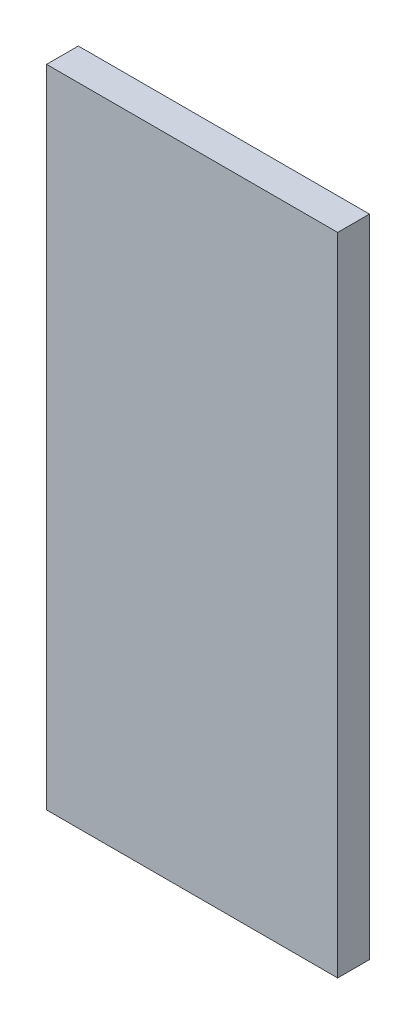
ISO-10303-21;
HEADER;
FILE_DESCRIPTION(('STEP AP214'),'2;1');
FILE_NAME('part.step','',(''),(''),'','','');
FILE_SCHEMA(('AUTOMOTIVE_DESIGN { 1 0 10303 214 1 1 1 1 }'));
ENDSEC;
DATA;
#1=APPLICATION_CONTEXT('core data for automotive mechanical design processes');
#2=APPLICATION_PROTOCOL_DEFINITION('international standard','automotive_design',2000,#1);
#3=PRODUCT_CONTEXT('',#1,'mechanical');
#4=PRODUCT('Part','Part','',(#3));
#5=PRODUCT_RELATED_PRODUCT_CATEGORY('part','',(#4));
#6=PRODUCT_DEFINITION_FORMATION('','',#4);
#7=PRODUCT_DEFINITION_CONTEXT('part definition',#1,'design');
#8=PRODUCT_DEFINITION('design','',#6,#7);
#9=PRODUCT_DEFINITION_SHAPE('','',#8);
#10=(LENGTH_UNIT() NAMED_UNIT(*) SI_UNIT(.MILLI.,.METRE.));
#11=(NAMED_UNIT(*) PLANE_ANGLE_UNIT() SI_UNIT($,.RADIAN.));
#12=(NAMED_UNIT(*) SI_UNIT($,.STERADIAN.) SOLID_ANGLE_UNIT());
#13=UNCERTAINTY_MEASURE_WITH_UNIT(LENGTH_MEASURE(1.E-05),#10,'distance_accuracy_value','');
#14=(GEOMETRIC_REPRESENTATION_CONTEXT(3) GLOBAL_UNCERTAINTY_ASSIGNED_CONTEXT((#13)) GLOBAL_UNIT_ASSIGNED_CONTEXT((#10,
#11,#12)) REPRESENTATION_CONTEXT('',''));
#15=CARTESIAN_POINT('',(0.,0.,0.));
#16=DIRECTION('',(0.,0.,1.));
#17=DIRECTION('',(1.,0.,0.));
#18=AXIS2_PLACEMENT_3D('',#15,#16,#17);
#19=CARTESIAN_POINT('',(13.75,30.5,3.));
#20=DIRECTION('',(-1.,0.,0.));
#21=DIRECTION('',(0.,-1.,0.));
#22=AXIS2_PLACEMENT_3D('',#19,#20,#21);
#23=PLANE('',#22);
#24=DIRECTION('',(0.,1.,0.));
#25=VECTOR('',#24,1.);
#26=CARTESIAN_POINT('',(13.75,30.5,0.));
#27=LINE('',#26,#25);
#28=CARTESIAN_POINT('',(13.75,-30.5,0.));
#29=VERTEX_POINT('',#28);
#30=CARTESIAN_POINT('',(13.75,30.5,0.));
#31=VERTEX_POINT('',#30);
#32=EDGE_CURVE('E100',#29,#31,#27,.T.);
#33=ORIENTED_EDGE('',*,*,#32,.T.);
#34=DIRECTION('',(0.,0.,-1.));
#35=VECTOR('',#34,1.);
#36=CARTESIAN_POINT('',(13.75,30.5,3.));
#37=LINE('',#36,#35);
#38=CARTESIAN_POINT('',(13.75,30.5,3.));
#39=VERTEX_POINT('',#38);
#40=EDGE_CURVE('E11',#39,#31,#37,.T.);
#41=ORIENTED_EDGE('',*,*,#40,.F.);
#42=DIRECTION('',(0.,1.,0.));
#43=VECTOR('',#42,1.);
#44=CARTESIAN_POINT('',(13.75,30.5,3.));
#45=LINE('',#44,#43);
#46=CARTESIAN_POINT('',(13.75,-30.5,3.));
#47=VERTEX_POINT('',#46);
#48=EDGE_CURVE('E88',#47,#39,#45,.T.);
#49=ORIENTED_EDGE('',*,*,#48,.F.);
#50=DIRECTION('',(0.,0.,-1.));
#51=VECTOR('',#50,1.);
#52=CARTESIAN_POINT('',(13.75,-30.5,3.));
#53=LINE('',#52,#51);
#54=EDGE_CURVE('E96',#47,#29,#53,.T.);
#55=ORIENTED_EDGE('',*,*,#54,.T.);
#56=EDGE_LOOP('',(#33,#41,#49,#55));
#57=FACE_BOUND('',#56,.T.);
#58=ADVANCED_FACE('F37',(#57),#23,.F.);
#59=CARTESIAN_POINT('',(-13.75,30.5,3.));
#60=DIRECTION('',(0.,-1.,0.));
#61=DIRECTION('',(0.,0.,-1.));
#62=AXIS2_PLACEMENT_3D('',#59,#60,#61);
#63=PLANE('',#62);
#64=DIRECTION('',(-1.,0.,0.));
#65=VECTOR('',#64,1.);
#66=CARTESIAN_POINT('',(-13.75,30.5,0.));
#67=LINE('',#66,#65);
#68=CARTESIAN_POINT('',(-13.75,30.5,0.));
#69=VERTEX_POINT('',#68);
#70=EDGE_CURVE('E92',#31,#69,#67,.T.);
#71=ORIENTED_EDGE('',*,*,#70,.T.);
#72=DIRECTION('',(0.,0.,-1.));
#73=VECTOR('',#72,1.);
#74=CARTESIAN_POINT('',(-13.75,30.5,3.));
#75=LINE('',#74,#73);
#76=CARTESIAN_POINT('',(-13.75,30.5,3.));
#77=VERTEX_POINT('',#76);
#78=EDGE_CURVE('E45',#77,#69,#75,.T.);
#79=ORIENTED_EDGE('',*,*,#78,.F.);
#80=DIRECTION('',(-1.,0.,0.));
#81=VECTOR('',#80,1.);
#82=CARTESIAN_POINT('',(-13.75,30.5,3.));
#83=LINE('',#82,#81);
#84=EDGE_CURVE('E83',#39,#77,#83,.T.);
#85=ORIENTED_EDGE('',*,*,#84,.F.);
#86=ORIENTED_EDGE('',*,*,#40,.T.);
#87=EDGE_LOOP('',(#71,#79,#85,#86));
#88=FACE_BOUND('',#87,.T.);
#89=ADVANCED_FACE('F91',(#88),#63,.F.);
#90=CARTESIAN_POINT('',(-13.75,30.5,3.));
#91=DIRECTION('',(1.,0.,0.));
#92=DIRECTION('',(0.,1.,0.));
#93=AXIS2_PLACEMENT_3D('',#90,#91,#92);
#94=PLANE('',#93);
#95=DIRECTION('',(0.,-1.,0.));
#96=VECTOR('',#95,1.);
#97=CARTESIAN_POINT('',(-13.75,30.5,0.));
#98=LINE('',#97,#96);
#99=CARTESIAN_POINT('',(-13.75,-30.5,0.));
#100=VERTEX_POINT('',#99);
#101=EDGE_CURVE('E70',#69,#100,#98,.T.);
#102=ORIENTED_EDGE('',*,*,#101,.T.);
#103=DIRECTION('',(0.,0.,-1.));
#104=VECTOR('',#103,1.);
#105=CARTESIAN_POINT('',(-13.75,-30.5,3.));
#106=LINE('',#105,#104);
#107=CARTESIAN_POINT('',(-13.75,-30.5,3.));
#108=VERTEX_POINT('',#107);
#109=EDGE_CURVE('E93',#108,#100,#106,.T.);
#110=ORIENTED_EDGE('',*,*,#109,.F.);
#111=DIRECTION('',(0.,-1.,0.));
#112=VECTOR('',#111,1.);
#113=CARTESIAN_POINT('',(-13.75,30.5,3.));
#114=LINE('',#113,#112);
#115=EDGE_CURVE('E86',#77,#108,#114,.T.);
#116=ORIENTED_EDGE('',*,*,#115,.F.);
#117=ORIENTED_EDGE('',*,*,#78,.T.);
#118=EDGE_LOOP('',(#102,#110,#116,#117));
#119=FACE_BOUND('',#118,.T.);
#120=ADVANCED_FACE('F94',(#119),#94,.F.);
#121=CARTESIAN_POINT('',(-13.75,-30.5,3.));
#122=DIRECTION('',(0.,1.,0.));
#123=DIRECTION('',(0.,0.,1.));
#124=AXIS2_PLACEMENT_3D('',#121,#122,#123);
#125=PLANE('',#124);
#126=DIRECTION('',(1.,0.,0.));
#127=VECTOR('',#126,1.);
#128=CARTESIAN_POINT('',(-13.75,-30.5,0.));
#129=LINE('',#128,#127);
#130=EDGE_CURVE('E76',#100,#29,#129,.T.);
#131=ORIENTED_EDGE('',*,*,#130,.T.);
#132=ORIENTED_EDGE('',*,*,#54,.F.);
#133=DIRECTION('',(1.,0.,0.));
#134=VECTOR('',#133,1.);
#135=CARTESIAN_POINT('',(-13.75,-30.5,3.));
#136=LINE('',#135,#134);
#137=EDGE_CURVE('E53',#108,#47,#136,.T.);
#138=ORIENTED_EDGE('',*,*,#137,.F.);
#139=ORIENTED_EDGE('',*,*,#109,.T.);
#140=EDGE_LOOP('',(#131,#132,#138,#139));
#141=FACE_BOUND('',#140,.T.);
#142=ADVANCED_FACE('F107',(#141),#125,.F.);
#143=CARTESIAN_POINT('',(0.,0.,3.));
#144=DIRECTION('',(0.,0.,1.));
#145=DIRECTION('',(1.,0.,0.));
#146=AXIS2_PLACEMENT_3D('',#143,#144,#145);
#147=PLANE('',#146);
#148=ORIENTED_EDGE('',*,*,#48,.T.);
#149=ORIENTED_EDGE('',*,*,#84,.T.);
#150=ORIENTED_EDGE('',*,*,#115,.T.);
#151=ORIENTED_EDGE('',*,*,#137,.T.);
#152=EDGE_LOOP('',(#148,#149,#150,#151));
#153=FACE_BOUND('',#152,.T.);
#154=ADVANCED_FACE('F84',(#153),#147,.T.);
#155=CARTESIAN_POINT('',(0.,0.,0.));
#156=DIRECTION('',(0.,0.,1.));
#157=DIRECTION('',(1.,0.,0.));
#158=AXIS2_PLACEMENT_3D('',#155,#156,#157);
#159=PLANE('',#158);
#160=ORIENTED_EDGE('',*,*,#32,.F.);
#161=ORIENTED_EDGE('',*,*,#130,.F.);
#162=ORIENTED_EDGE('',*,*,#101,.F.);
#163=ORIENTED_EDGE('',*,*,#70,.F.);
#164=EDGE_LOOP('',(#160,#161,#162,#163));
#165=FACE_BOUND('',#164,.T.);
#166=ADVANCED_FACE('F110',(#165),#159,.F.);
#167=CLOSED_SHELL('',(#58,#89,#120,#142,#154,#166));
#168=MANIFOLD_SOLID_BREP('B2',#167);
#169=ADVANCED_BREP_SHAPE_REPRESENTATION('',(#18,#168),#14);
#170=SHAPE_DEFINITION_REPRESENTATION(#9,#169);
ENDSEC;
END-ISO-10303-21;
